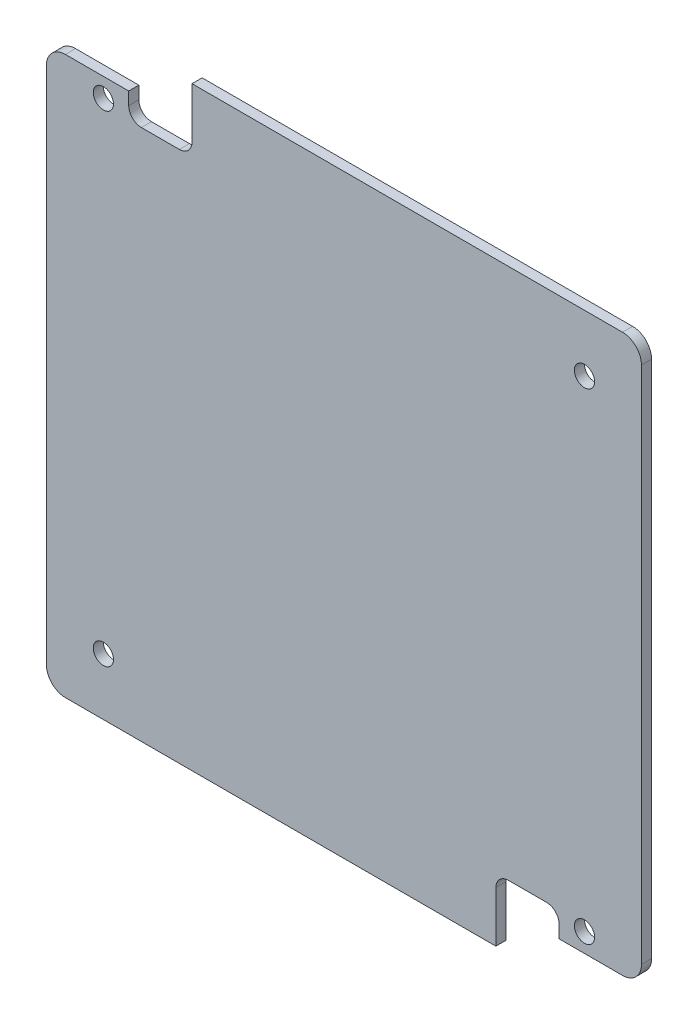
ISO-10303-21;
HEADER;
FILE_DESCRIPTION(('STEP AP214'),'2;1');
FILE_NAME('part.step','',(''),(''),'','','');
FILE_SCHEMA(('AUTOMOTIVE_DESIGN { 1 0 10303 214 1 1 1 1 }'));
ENDSEC;
DATA;
#1=APPLICATION_CONTEXT('core data for automotive mechanical design processes');
#2=APPLICATION_PROTOCOL_DEFINITION('international standard','automotive_design',2000,#1);
#3=PRODUCT_CONTEXT('',#1,'mechanical');
#4=PRODUCT('Part','Part','',(#3));
#5=PRODUCT_RELATED_PRODUCT_CATEGORY('part','',(#4));
#6=PRODUCT_DEFINITION_FORMATION('','',#4);
#7=PRODUCT_DEFINITION_CONTEXT('part definition',#1,'design');
#8=PRODUCT_DEFINITION('design','',#6,#7);
#9=PRODUCT_DEFINITION_SHAPE('','',#8);
#10=(LENGTH_UNIT() NAMED_UNIT(*) SI_UNIT(.MILLI.,.METRE.));
#11=(NAMED_UNIT(*) PLANE_ANGLE_UNIT() SI_UNIT($,.RADIAN.));
#12=(NAMED_UNIT(*) SI_UNIT($,.STERADIAN.) SOLID_ANGLE_UNIT());
#13=UNCERTAINTY_MEASURE_WITH_UNIT(LENGTH_MEASURE(1.E-05),#10,'distance_accuracy_value','');
#14=(GEOMETRIC_REPRESENTATION_CONTEXT(3) GLOBAL_UNCERTAINTY_ASSIGNED_CONTEXT((#13)) GLOBAL_UNIT_ASSIGNED_CONTEXT((#10,
#11,#12)) REPRESENTATION_CONTEXT('',''));
#15=CARTESIAN_POINT('',(0.,0.,0.));
#16=DIRECTION('',(0.,0.,1.));
#17=DIRECTION('',(1.,0.,0.));
#18=AXIS2_PLACEMENT_3D('',#15,#16,#17);
#19=CARTESIAN_POINT('',(3.43465612004684,6.9518569300749,0.));
#20=DIRECTION('',(0.,0.,1.));
#21=DIRECTION('',(1.,0.,0.));
#22=AXIS2_PLACEMENT_3D('',#19,#20,#21);
#23=PLANE('',#22);
#24=CARTESIAN_POINT('',(-78.5653438799532,82.9518569300749,0.));
#25=DIRECTION('',(0.,0.,-1.));
#26=DIRECTION('',(-1.,0.,0.));
#27=AXIS2_PLACEMENT_3D('',#24,#25,#26);
#28=CIRCLE('',#27,1.59999999999999);
#29=CARTESIAN_POINT('',(-80.1653438799532,82.9518569300749,0.));
#30=VERTEX_POINT('',#29);
#31=EDGE_CURVE('E387',#30,#30,#28,.T.);
#32=ORIENTED_EDGE('',*,*,#31,.F.);
#33=EDGE_LOOP('',(#32));
#34=FACE_BOUND('',#33,.T.);
#35=CARTESIAN_POINT('',(-2.56534387995316,6.95185693007487,0.));
#36=DIRECTION('',(0.,0.,-1.));
#37=DIRECTION('',(-1.,0.,0.));
#38=AXIS2_PLACEMENT_3D('',#35,#36,#37);
#39=CIRCLE('',#38,1.59999999999999);
#40=CARTESIAN_POINT('',(-4.16534387995315,6.95185693007487,0.));
#41=VERTEX_POINT('',#40);
#42=EDGE_CURVE('E375',#41,#41,#39,.T.);
#43=ORIENTED_EDGE('',*,*,#42,.F.);
#44=EDGE_LOOP('',(#43));
#45=FACE_BOUND('',#44,.T.);
#46=DIRECTION('',(1.,0.,0.));
#47=VECTOR('',#46,1.);
#48=CARTESIAN_POINT('',(-16.5653438799532,7.9518569300749,0.));
#49=LINE('',#48,#47);
#50=CARTESIAN_POINT('',(-14.5653438799532,7.9518569300749,0.));
#51=VERTEX_POINT('',#50);
#52=CARTESIAN_POINT('',(-8.56534387995316,7.9518569300749,0.));
#53=VERTEX_POINT('',#52);
#54=EDGE_CURVE('E229',#51,#53,#49,.T.);
#55=ORIENTED_EDGE('',*,*,#54,.F.);
#56=CARTESIAN_POINT('',(-14.5653438799532,5.9518569300749,0.));
#57=DIRECTION('',(0.,0.,1.));
#58=DIRECTION('',(1.,0.,0.));
#59=AXIS2_PLACEMENT_3D('',#56,#57,#58);
#60=CIRCLE('',#59,2.);
#61=CARTESIAN_POINT('',(-16.5653438799532,5.9518569300749,0.));
#62=VERTEX_POINT('',#61);
#63=EDGE_CURVE('E312',#51,#62,#60,.T.);
#64=ORIENTED_EDGE('',*,*,#63,.T.);
#65=DIRECTION('',(0.,-1.,0.));
#66=VECTOR('',#65,1.);
#67=CARTESIAN_POINT('',(-16.5653438799532,7.9518569300749,0.));
#68=LINE('',#67,#66);
#69=CARTESIAN_POINT('',(-16.5653438799532,-2.0481430699251,0.));
#70=VERTEX_POINT('',#69);
#71=EDGE_CURVE('E268',#62,#70,#68,.T.);
#72=ORIENTED_EDGE('',*,*,#71,.T.);
#73=DIRECTION('',(1.,0.,0.));
#74=VECTOR('',#73,1.);
#75=CARTESIAN_POINT('',(-84.5653438799531,-2.0481430699251,0.));
#76=LINE('',#75,#74);
#77=CARTESIAN_POINT('',(-84.5653438799531,-2.0481430699251,0.));
#78=VERTEX_POINT('',#77);
#79=EDGE_CURVE('E265',#78,#70,#76,.T.);
#80=ORIENTED_EDGE('',*,*,#79,.F.);
#81=CARTESIAN_POINT('',(-84.5653438799531,0.9518569300749,0.));
#82=DIRECTION('',(0.,0.,1.));
#83=DIRECTION('',(1.,0.,0.));
#84=AXIS2_PLACEMENT_3D('',#81,#82,#83);
#85=CIRCLE('',#84,3.);
#86=CARTESIAN_POINT('',(-87.5653438799531,0.951856930074922,0.));
#87=VERTEX_POINT('',#86);
#88=EDGE_CURVE('E263',#87,#78,#85,.T.);
#89=ORIENTED_EDGE('',*,*,#88,.F.);
#90=DIRECTION('',(0.,1.,0.));
#91=VECTOR('',#90,1.);
#92=CARTESIAN_POINT('',(-87.5653438799531,0.951856930074922,0.));
#93=LINE('',#92,#91);
#94=CARTESIAN_POINT('',(-87.5653438799531,82.9518569300748,0.));
#95=VERTEX_POINT('',#94);
#96=EDGE_CURVE('E260',#87,#95,#93,.T.);
#97=ORIENTED_EDGE('',*,*,#96,.T.);
#98=CARTESIAN_POINT('',(-84.5653438799531,82.9518569300749,0.));
#99=DIRECTION('',(0.,0.,1.));
#100=DIRECTION('',(1.,0.,0.));
#101=AXIS2_PLACEMENT_3D('',#98,#99,#100);
#102=CIRCLE('',#101,3.);
#103=CARTESIAN_POINT('',(-84.5653438799531,85.9518569300749,0.));
#104=VERTEX_POINT('',#103);
#105=EDGE_CURVE('E257',#104,#95,#102,.T.);
#106=ORIENTED_EDGE('',*,*,#105,.F.);
#107=DIRECTION('',(-1.,0.,0.));
#108=VECTOR('',#107,1.);
#109=CARTESIAN_POINT('',(-74.5653438799531,85.9518569300749,0.));
#110=LINE('',#109,#108);
#111=CARTESIAN_POINT('',(-74.5653438799531,85.9518569300749,0.));
#112=VERTEX_POINT('',#111);
#113=EDGE_CURVE('E255',#112,#104,#110,.T.);
#114=ORIENTED_EDGE('',*,*,#113,.F.);
#115=DIRECTION('',(0.,1.,0.));
#116=VECTOR('',#115,1.);
#117=CARTESIAN_POINT('',(-74.5653438799531,81.9518569300749,0.));
#118=LINE('',#117,#116);
#119=CARTESIAN_POINT('',(-74.5653438799531,83.9518569300749,0.));
#120=VERTEX_POINT('',#119);
#121=EDGE_CURVE('E253',#120,#112,#118,.T.);
#122=ORIENTED_EDGE('',*,*,#121,.F.);
#123=CARTESIAN_POINT('',(-72.5653438799531,83.9518569300749,0.));
#124=DIRECTION('',(0.,0.,1.));
#125=DIRECTION('',(1.,0.,0.));
#126=AXIS2_PLACEMENT_3D('',#123,#124,#125);
#127=CIRCLE('',#126,2.);
#128=CARTESIAN_POINT('',(-72.5653438799531,81.9518569300749,0.));
#129=VERTEX_POINT('',#128);
#130=EDGE_CURVE('E40',#120,#129,#127,.T.);
#131=ORIENTED_EDGE('',*,*,#130,.T.);
#132=DIRECTION('',(-1.,0.,0.));
#133=VECTOR('',#132,1.);
#134=CARTESIAN_POINT('',(-64.5653438799531,81.9518569300749,0.));
#135=LINE('',#134,#133);
#136=CARTESIAN_POINT('',(-66.5653438799531,81.9518569300749,0.));
#137=VERTEX_POINT('',#136);
#138=EDGE_CURVE('E250',#137,#129,#135,.T.);
#139=ORIENTED_EDGE('',*,*,#138,.F.);
#140=CARTESIAN_POINT('',(-66.5653438799531,83.9518569300749,0.));
#141=DIRECTION('',(0.,0.,1.));
#142=DIRECTION('',(1.,0.,0.));
#143=AXIS2_PLACEMENT_3D('',#140,#141,#142);
#144=CIRCLE('',#143,2.);
#145=CARTESIAN_POINT('',(-64.5653438799531,83.9518569300749,0.));
#146=VERTEX_POINT('',#145);
#147=EDGE_CURVE('E319',#137,#146,#144,.T.);
#148=ORIENTED_EDGE('',*,*,#147,.T.);
#149=DIRECTION('',(0.,-1.,0.));
#150=VECTOR('',#149,1.);
#151=CARTESIAN_POINT('',(-64.5653438799531,91.9518569300749,0.));
#152=LINE('',#151,#150);
#153=CARTESIAN_POINT('',(-64.5653438799531,91.9518569300749,0.));
#154=VERTEX_POINT('',#153);
#155=EDGE_CURVE('E247',#154,#146,#152,.T.);
#156=ORIENTED_EDGE('',*,*,#155,.F.);
#157=DIRECTION('',(1.,0.,0.));
#158=VECTOR('',#157,1.);
#159=CARTESIAN_POINT('',(-64.5653438799531,91.9518569300749,0.));
#160=LINE('',#159,#158);
#161=CARTESIAN_POINT('',(3.43465612004681,91.9518569300749,0.));
#162=VERTEX_POINT('',#161);
#163=EDGE_CURVE('E244',#154,#162,#160,.T.);
#164=ORIENTED_EDGE('',*,*,#163,.T.);
#165=CARTESIAN_POINT('',(3.43465612004683,88.9518569300749,0.));
#166=DIRECTION('',(0.,0.,-1.));
#167=DIRECTION('',(-1.,0.,0.));
#168=AXIS2_PLACEMENT_3D('',#165,#166,#167);
#169=CIRCLE('',#168,3.);
#170=CARTESIAN_POINT('',(6.43465612004683,88.9518569300748,0.));
#171=VERTEX_POINT('',#170);
#172=EDGE_CURVE('E241',#162,#171,#169,.T.);
#173=ORIENTED_EDGE('',*,*,#172,.T.);
#174=DIRECTION('',(0.,1.,0.));
#175=VECTOR('',#174,1.);
#176=CARTESIAN_POINT('',(6.43465612004684,6.9518569300749,0.));
#177=LINE('',#176,#175);
#178=CARTESIAN_POINT('',(6.43465612004684,6.9518569300749,0.));
#179=VERTEX_POINT('',#178);
#180=EDGE_CURVE('E238',#179,#171,#177,.T.);
#181=ORIENTED_EDGE('',*,*,#180,.F.);
#182=CARTESIAN_POINT('',(3.43465612004684,6.9518569300749,0.));
#183=DIRECTION('',(0.,0.,1.));
#184=DIRECTION('',(1.,0.,0.));
#185=AXIS2_PLACEMENT_3D('',#182,#183,#184);
#186=CIRCLE('',#185,3.);
#187=CARTESIAN_POINT('',(3.43465612004684,3.9518569300749,0.));
#188=VERTEX_POINT('',#187);
#189=EDGE_CURVE('E236',#188,#179,#186,.T.);
#190=ORIENTED_EDGE('',*,*,#189,.F.);
#191=DIRECTION('',(-1.,0.,0.));
#192=VECTOR('',#191,1.);
#193=CARTESIAN_POINT('',(3.43465612004684,3.9518569300749,0.));
#194=LINE('',#193,#192);
#195=CARTESIAN_POINT('',(-6.56534387995316,3.9518569300749,0.));
#196=VERTEX_POINT('',#195);
#197=EDGE_CURVE('E234',#188,#196,#194,.T.);
#198=ORIENTED_EDGE('',*,*,#197,.T.);
#199=DIRECTION('',(0.,-1.,0.));
#200=VECTOR('',#199,1.);
#201=CARTESIAN_POINT('',(-6.56534387995316,7.9518569300749,0.));
#202=LINE('',#201,#200);
#203=CARTESIAN_POINT('',(-6.56534387995316,5.9518569300749,0.));
#204=VERTEX_POINT('',#203);
#205=EDGE_CURVE('E185',#204,#196,#202,.T.);
#206=ORIENTED_EDGE('',*,*,#205,.F.);
#207=CARTESIAN_POINT('',(-8.56534387995316,5.9518569300749,0.));
#208=DIRECTION('',(0.,0.,1.));
#209=DIRECTION('',(1.,0.,0.));
#210=AXIS2_PLACEMENT_3D('',#207,#208,#209);
#211=CIRCLE('',#210,2.);
#212=EDGE_CURVE('E316',#204,#53,#211,.T.);
#213=ORIENTED_EDGE('',*,*,#212,.T.);
#214=EDGE_LOOP('',(#55,#64,#72,#80,#89,#97,#106,#114,#122,#131,#139,#148,#156,#164,#173,#181,
#190,#198,#206,#213));
#215=FACE_BOUND('',#214,.T.);
#216=CARTESIAN_POINT('',(-2.56534387995319,82.9518569300749,0.));
#217=DIRECTION('',(0.,0.,-1.));
#218=DIRECTION('',(-1.,0.,0.));
#219=AXIS2_PLACEMENT_3D('',#216,#217,#218);
#220=CIRCLE('',#219,1.59999999999999);
#221=CARTESIAN_POINT('',(-4.16534387995318,82.9518569300749,0.));
#222=VERTEX_POINT('',#221);
#223=EDGE_CURVE('E381',#222,#222,#220,.T.);
#224=ORIENTED_EDGE('',*,*,#223,.F.);
#225=EDGE_LOOP('',(#224));
#226=FACE_BOUND('',#225,.T.);
#227=CARTESIAN_POINT('',(-78.5653438799531,6.95185693007482,0.));
#228=DIRECTION('',(0.,0.,-1.));
#229=DIRECTION('',(-1.,0.,0.));
#230=AXIS2_PLACEMENT_3D('',#227,#228,#229);
#231=CIRCLE('',#230,1.59999999999999);
#232=CARTESIAN_POINT('',(-80.1653438799531,6.95185693007482,0.));
#233=VERTEX_POINT('',#232);
#234=EDGE_CURVE('E393',#233,#233,#231,.T.);
#235=ORIENTED_EDGE('',*,*,#234,.F.);
#236=EDGE_LOOP('',(#235));
#237=FACE_BOUND('',#236,.T.);
#238=ADVANCED_FACE('F32',(#34,#45,#215,#226,#237),#23,.F.);
#239=CARTESIAN_POINT('',(-16.5653438799532,7.9518569300749,1.6));
#240=DIRECTION('',(0.,1.,0.));
#241=DIRECTION('',(0.,0.,1.));
#242=AXIS2_PLACEMENT_3D('',#239,#240,#241);
#243=PLANE('',#242);
#244=DIRECTION('',(1.,0.,0.));
#245=VECTOR('',#244,1.);
#246=CARTESIAN_POINT('',(-16.5653438799532,7.9518569300749,1.6));
#247=LINE('',#246,#245);
#248=CARTESIAN_POINT('',(-14.5653438799532,7.9518569300749,1.6));
#249=VERTEX_POINT('',#248);
#250=CARTESIAN_POINT('',(-8.56534387995316,7.9518569300749,1.6));
#251=VERTEX_POINT('',#250);
#252=EDGE_CURVE('E179',#249,#251,#247,.T.);
#253=ORIENTED_EDGE('',*,*,#252,.F.);
#254=DIRECTION('',(0.,0.,-1.));
#255=VECTOR('',#254,1.);
#256=CARTESIAN_POINT('',(-14.5653438799532,7.9518569300749,1.6));
#257=LINE('',#256,#255);
#258=EDGE_CURVE('E296',#249,#51,#257,.T.);
#259=ORIENTED_EDGE('',*,*,#258,.T.);
#260=ORIENTED_EDGE('',*,*,#54,.T.);
#261=DIRECTION('',(0.,0.,-1.));
#262=VECTOR('',#261,1.);
#263=CARTESIAN_POINT('',(-8.56534387995316,7.9518569300749,1.6));
#264=LINE('',#263,#262);
#265=EDGE_CURVE('E189',#53,#251,#264,.F.);
#266=ORIENTED_EDGE('',*,*,#265,.T.);
#267=EDGE_LOOP('',(#253,#259,#260,#266));
#268=FACE_BOUND('',#267,.T.);
#269=ADVANCED_FACE('F368',(#268),#243,.F.);
#270=CARTESIAN_POINT('',(-6.56534387995316,7.9518569300749,1.6));
#271=DIRECTION('',(1.,0.,0.));
#272=DIRECTION('',(0.,1.,0.));
#273=AXIS2_PLACEMENT_3D('',#270,#271,#272);
#274=PLANE('',#273);
#275=DIRECTION('',(0.,-1.,0.));
#276=VECTOR('',#275,1.);
#277=CARTESIAN_POINT('',(-6.56534387995316,7.9518569300749,1.6));
#278=LINE('',#277,#276);
#279=CARTESIAN_POINT('',(-6.56534387995316,5.9518569300749,1.6));
#280=VERTEX_POINT('',#279);
#281=CARTESIAN_POINT('',(-6.56534387995316,3.9518569300749,1.6));
#282=VERTEX_POINT('',#281);
#283=EDGE_CURVE('E166',#280,#282,#278,.T.);
#284=ORIENTED_EDGE('',*,*,#283,.F.);
#285=DIRECTION('',(0.,0.,-1.));
#286=VECTOR('',#285,1.);
#287=CARTESIAN_POINT('',(-6.56534387995316,5.9518569300749,0.));
#288=LINE('',#287,#286);
#289=EDGE_CURVE('E301',#280,#204,#288,.T.);
#290=ORIENTED_EDGE('',*,*,#289,.T.);
#291=ORIENTED_EDGE('',*,*,#205,.T.);
#292=DIRECTION('',(0.,0.,-1.));
#293=VECTOR('',#292,1.);
#294=CARTESIAN_POINT('',(-6.56534387995316,3.9518569300749,1.6));
#295=LINE('',#294,#293);
#296=EDGE_CURVE('E182',#282,#196,#295,.T.);
#297=ORIENTED_EDGE('',*,*,#296,.F.);
#298=EDGE_LOOP('',(#284,#290,#291,#297));
#299=FACE_BOUND('',#298,.T.);
#300=ADVANCED_FACE('F183',(#299),#274,.F.);
#301=CARTESIAN_POINT('',(3.43465612004684,3.9518569300749,1.6));
#302=DIRECTION('',(0.,-1.,0.));
#303=DIRECTION('',(1.,0.,0.));
#304=AXIS2_PLACEMENT_3D('',#301,#302,#303);
#305=PLANE('',#304);
#306=ORIENTED_EDGE('',*,*,#197,.F.);
#307=DIRECTION('',(0.,0.,-1.));
#308=VECTOR('',#307,1.);
#309=CARTESIAN_POINT('',(3.43465612004684,3.9518569300749,1.6));
#310=LINE('',#309,#308);
#311=CARTESIAN_POINT('',(3.43465612004684,3.9518569300749,1.6));
#312=VERTEX_POINT('',#311);
#313=EDGE_CURVE('E190',#312,#188,#310,.T.);
#314=ORIENTED_EDGE('',*,*,#313,.F.);
#315=DIRECTION('',(-1.,0.,0.));
#316=VECTOR('',#315,1.);
#317=CARTESIAN_POINT('',(3.4257089308049,3.9518569300749,1.6));
#318=LINE('',#317,#316);
#319=EDGE_CURVE('E171',#312,#282,#318,.T.);
#320=ORIENTED_EDGE('',*,*,#319,.T.);
#321=ORIENTED_EDGE('',*,*,#296,.T.);
#322=EDGE_LOOP('',(#306,#314,#320,#321));
#323=FACE_BOUND('',#322,.T.);
#324=ADVANCED_FACE('F192',(#323),#305,.T.);
#325=CARTESIAN_POINT('',(3.43465612004684,6.9518569300749,1.6));
#326=DIRECTION('',(0.,0.,-1.));
#327=DIRECTION('',(-1.,0.,0.));
#328=AXIS2_PLACEMENT_3D('',#325,#326,#327);
#329=CYLINDRICAL_SURFACE('',#328,3.);
#330=ORIENTED_EDGE('',*,*,#189,.T.);
#331=DIRECTION('',(0.,0.,-1.));
#332=VECTOR('',#331,1.);
#333=CARTESIAN_POINT('',(6.43465612004684,6.9518569300749,1.6));
#334=LINE('',#333,#332);
#335=CARTESIAN_POINT('',(6.43465612004684,6.9518569300749,1.6));
#336=VERTEX_POINT('',#335);
#337=EDGE_CURVE('E291',#336,#179,#334,.T.);
#338=ORIENTED_EDGE('',*,*,#337,.F.);
#339=CARTESIAN_POINT('',(3.43465612004684,6.9518569300749,1.6));
#340=DIRECTION('',(0.,0.,1.));
#341=DIRECTION('',(1.,0.,0.));
#342=AXIS2_PLACEMENT_3D('',#339,#340,#341);
#343=CIRCLE('',#342,3.);
#344=EDGE_CURVE('E194',#312,#336,#343,.T.);
#345=ORIENTED_EDGE('',*,*,#344,.F.);
#346=ORIENTED_EDGE('',*,*,#313,.T.);
#347=EDGE_LOOP('',(#330,#338,#345,#346));
#348=FACE_BOUND('',#347,.T.);
#349=ADVANCED_FACE('F443',(#348),#329,.T.);
#350=CARTESIAN_POINT('',(6.43465612004684,6.9518569300749,1.6));
#351=DIRECTION('',(-1.,0.,0.));
#352=DIRECTION('',(0.,-1.,0.));
#353=AXIS2_PLACEMENT_3D('',#350,#351,#352);
#354=PLANE('',#353);
#355=ORIENTED_EDGE('',*,*,#180,.T.);
#356=DIRECTION('',(0.,0.,-1.));
#357=VECTOR('',#356,1.);
#358=CARTESIAN_POINT('',(6.43465612004683,88.9518569300748,1.6));
#359=LINE('',#358,#357);
#360=CARTESIAN_POINT('',(6.43465612004683,88.9518569300748,1.6));
#361=VERTEX_POINT('',#360);
#362=EDGE_CURVE('E289',#361,#171,#359,.T.);
#363=ORIENTED_EDGE('',*,*,#362,.F.);
#364=DIRECTION('',(0.,1.,0.));
#365=VECTOR('',#364,1.);
#366=CARTESIAN_POINT('',(6.43465612004684,6.9518569300749,1.6));
#367=LINE('',#366,#365);
#368=EDGE_CURVE('E196',#336,#361,#367,.T.);
#369=ORIENTED_EDGE('',*,*,#368,.F.);
#370=ORIENTED_EDGE('',*,*,#337,.T.);
#371=EDGE_LOOP('',(#355,#363,#369,#370));
#372=FACE_BOUND('',#371,.T.);
#373=ADVANCED_FACE('F439',(#372),#354,.F.);
#374=CARTESIAN_POINT('',(3.43465612004683,88.9518569300749,1.6));
#375=DIRECTION('',(0.,0.,-1.));
#376=DIRECTION('',(-1.,0.,0.));
#377=AXIS2_PLACEMENT_3D('',#374,#375,#376);
#378=CYLINDRICAL_SURFACE('',#377,3.);
#379=ORIENTED_EDGE('',*,*,#172,.F.);
#380=DIRECTION('',(0.,0.,-1.));
#381=VECTOR('',#380,1.);
#382=CARTESIAN_POINT('',(3.43465612004681,91.9518569300749,1.6));
#383=LINE('',#382,#381);
#384=CARTESIAN_POINT('',(3.43465612004681,91.9518569300749,1.6));
#385=VERTEX_POINT('',#384);
#386=EDGE_CURVE('E287',#385,#162,#383,.T.);
#387=ORIENTED_EDGE('',*,*,#386,.F.);
#388=CARTESIAN_POINT('',(3.43465612004683,88.9518569300749,1.6));
#389=DIRECTION('',(0.,0.,-1.));
#390=DIRECTION('',(-1.,0.,0.));
#391=AXIS2_PLACEMENT_3D('',#388,#389,#390);
#392=CIRCLE('',#391,3.);
#393=EDGE_CURVE('E201',#385,#361,#392,.T.);
#394=ORIENTED_EDGE('',*,*,#393,.T.);
#395=ORIENTED_EDGE('',*,*,#362,.T.);
#396=EDGE_LOOP('',(#379,#387,#394,#395));
#397=FACE_BOUND('',#396,.T.);
#398=ADVANCED_FACE('F435',(#397),#378,.T.);
#399=CARTESIAN_POINT('',(-64.5653438799531,91.9518569300749,1.6));
#400=DIRECTION('',(0.,1.,0.));
#401=DIRECTION('',(0.,0.,1.));
#402=AXIS2_PLACEMENT_3D('',#399,#400,#401);
#403=PLANE('',#402);
#404=ORIENTED_EDGE('',*,*,#163,.F.);
#405=DIRECTION('',(0.,0.,-1.));
#406=VECTOR('',#405,1.);
#407=CARTESIAN_POINT('',(-64.5653438799531,91.9518569300749,1.6));
#408=LINE('',#407,#406);
#409=CARTESIAN_POINT('',(-64.5653438799531,91.9518569300749,1.6));
#410=VERTEX_POINT('',#409);
#411=EDGE_CURVE('E285',#410,#154,#408,.T.);
#412=ORIENTED_EDGE('',*,*,#411,.F.);
#413=DIRECTION('',(1.,0.,0.));
#414=VECTOR('',#413,1.);
#415=CARTESIAN_POINT('',(-64.5653438799531,91.9518569300749,1.6));
#416=LINE('',#415,#414);
#417=EDGE_CURVE('E204',#410,#385,#416,.T.);
#418=ORIENTED_EDGE('',*,*,#417,.T.);
#419=ORIENTED_EDGE('',*,*,#386,.T.);
#420=EDGE_LOOP('',(#404,#412,#418,#419));
#421=FACE_BOUND('',#420,.T.);
#422=ADVANCED_FACE('F431',(#421),#403,.T.);
#423=CARTESIAN_POINT('',(-64.5653438799531,91.9518569300749,1.6));
#424=DIRECTION('',(1.,0.,0.));
#425=DIRECTION('',(0.,0.,-1.));
#426=AXIS2_PLACEMENT_3D('',#423,#424,#425);
#427=PLANE('',#426);
#428=ORIENTED_EDGE('',*,*,#155,.T.);
#429=DIRECTION('',(0.,0.,-1.));
#430=VECTOR('',#429,1.);
#431=CARTESIAN_POINT('',(-64.5653438799531,83.9518569300749,1.6));
#432=LINE('',#431,#430);
#433=CARTESIAN_POINT('',(-64.5653438799531,83.9518569300749,1.6));
#434=VERTEX_POINT('',#433);
#435=EDGE_CURVE('E308',#146,#434,#432,.F.);
#436=ORIENTED_EDGE('',*,*,#435,.T.);
#437=DIRECTION('',(0.,-1.,0.));
#438=VECTOR('',#437,1.);
#439=CARTESIAN_POINT('',(-64.5653438799531,91.9518569300749,1.6));
#440=LINE('',#439,#438);
#441=EDGE_CURVE('E207',#410,#434,#440,.T.);
#442=ORIENTED_EDGE('',*,*,#441,.F.);
#443=ORIENTED_EDGE('',*,*,#411,.T.);
#444=EDGE_LOOP('',(#428,#436,#442,#443));
#445=FACE_BOUND('',#444,.T.);
#446=ADVANCED_FACE('F428',(#445),#427,.F.);
#447=CARTESIAN_POINT('',(-64.5653438799531,81.9518569300749,1.6));
#448=DIRECTION('',(0.,-1.,0.));
#449=DIRECTION('',(0.,0.,-1.));
#450=AXIS2_PLACEMENT_3D('',#447,#448,#449);
#451=PLANE('',#450);
#452=DIRECTION('',(-1.,0.,0.));
#453=VECTOR('',#452,1.);
#454=CARTESIAN_POINT('',(-64.5653438799531,81.9518569300749,1.6));
#455=LINE('',#454,#453);
#456=CARTESIAN_POINT('',(-66.5653438799531,81.9518569300749,1.6));
#457=VERTEX_POINT('',#456);
#458=CARTESIAN_POINT('',(-72.5653438799531,81.9518569300749,1.6));
#459=VERTEX_POINT('',#458);
#460=EDGE_CURVE('E210',#457,#459,#455,.T.);
#461=ORIENTED_EDGE('',*,*,#460,.F.);
#462=DIRECTION('',(0.,0.,-1.));
#463=VECTOR('',#462,1.);
#464=CARTESIAN_POINT('',(-66.5653438799531,81.9518569300749,0.));
#465=LINE('',#464,#463);
#466=EDGE_CURVE('E305',#457,#137,#465,.T.);
#467=ORIENTED_EDGE('',*,*,#466,.T.);
#468=ORIENTED_EDGE('',*,*,#138,.T.);
#469=DIRECTION('',(0.,0.,-1.));
#470=VECTOR('',#469,1.);
#471=CARTESIAN_POINT('',(-72.5653438799531,81.9518569300749,1.6));
#472=LINE('',#471,#470);
#473=EDGE_CURVE('E303',#129,#459,#472,.F.);
#474=ORIENTED_EDGE('',*,*,#473,.T.);
#475=EDGE_LOOP('',(#461,#467,#468,#474));
#476=FACE_BOUND('',#475,.T.);
#477=ADVANCED_FACE('F330',(#476),#451,.F.);
#478=CARTESIAN_POINT('',(-74.5653438799531,81.9518569300749,1.6));
#479=DIRECTION('',(-1.,0.,0.));
#480=DIRECTION('',(0.,0.,1.));
#481=AXIS2_PLACEMENT_3D('',#478,#479,#480);
#482=PLANE('',#481);
#483=DIRECTION('',(0.,1.,0.));
#484=VECTOR('',#483,1.);
#485=CARTESIAN_POINT('',(-74.5653438799531,81.9518569300749,1.6));
#486=LINE('',#485,#484);
#487=CARTESIAN_POINT('',(-74.5653438799531,83.9518569300749,1.6));
#488=VERTEX_POINT('',#487);
#489=CARTESIAN_POINT('',(-74.5653438799531,85.9518569300749,1.6));
#490=VERTEX_POINT('',#489);
#491=EDGE_CURVE('E212',#488,#490,#486,.T.);
#492=ORIENTED_EDGE('',*,*,#491,.F.);
#493=DIRECTION('',(0.,0.,-1.));
#494=VECTOR('',#493,1.);
#495=CARTESIAN_POINT('',(-74.5653438799531,83.9518569300749,0.));
#496=LINE('',#495,#494);
#497=EDGE_CURVE('E310',#488,#120,#496,.T.);
#498=ORIENTED_EDGE('',*,*,#497,.T.);
#499=ORIENTED_EDGE('',*,*,#121,.T.);
#500=DIRECTION('',(0.,0.,-1.));
#501=VECTOR('',#500,1.);
#502=CARTESIAN_POINT('',(-74.5653438799531,85.9518569300749,1.6));
#503=LINE('',#502,#501);
#504=EDGE_CURVE('E282',#490,#112,#503,.T.);
#505=ORIENTED_EDGE('',*,*,#504,.F.);
#506=EDGE_LOOP('',(#492,#498,#499,#505));
#507=FACE_BOUND('',#506,.T.);
#508=ADVANCED_FACE('F333',(#507),#482,.F.);
#509=CARTESIAN_POINT('',(-74.5653438799531,85.9518569300749,1.6));
#510=DIRECTION('',(0.,-1.,0.));
#511=DIRECTION('',(0.,0.,-1.));
#512=AXIS2_PLACEMENT_3D('',#509,#510,#511);
#513=PLANE('',#512);
#514=ORIENTED_EDGE('',*,*,#113,.T.);
#515=DIRECTION('',(0.,0.,-1.));
#516=VECTOR('',#515,1.);
#517=CARTESIAN_POINT('',(-84.5653438799531,85.9518569300749,1.6));
#518=LINE('',#517,#516);
#519=CARTESIAN_POINT('',(-84.5653438799531,85.9518569300749,1.6));
#520=VERTEX_POINT('',#519);
#521=EDGE_CURVE('E279',#520,#104,#518,.T.);
#522=ORIENTED_EDGE('',*,*,#521,.F.);
#523=DIRECTION('',(-1.,0.,0.));
#524=VECTOR('',#523,1.);
#525=CARTESIAN_POINT('',(-74.5653438799531,85.9518569300749,1.6));
#526=LINE('',#525,#524);
#527=EDGE_CURVE('E214',#490,#520,#526,.T.);
#528=ORIENTED_EDGE('',*,*,#527,.F.);
#529=ORIENTED_EDGE('',*,*,#504,.T.);
#530=EDGE_LOOP('',(#514,#522,#528,#529));
#531=FACE_BOUND('',#530,.T.);
#532=ADVANCED_FACE('F341',(#531),#513,.F.);
#533=CARTESIAN_POINT('',(-84.5653438799531,82.9518569300749,1.6));
#534=DIRECTION('',(0.,0.,-1.));
#535=DIRECTION('',(-1.,0.,0.));
#536=AXIS2_PLACEMENT_3D('',#533,#534,#535);
#537=CYLINDRICAL_SURFACE('',#536,3.);
#538=ORIENTED_EDGE('',*,*,#105,.T.);
#539=DIRECTION('',(0.,0.,-1.));
#540=VECTOR('',#539,1.);
#541=CARTESIAN_POINT('',(-87.5653438799531,82.9518569300748,1.6));
#542=LINE('',#541,#540);
#543=CARTESIAN_POINT('',(-87.5653438799531,82.9518569300748,1.6));
#544=VERTEX_POINT('',#543);
#545=EDGE_CURVE('E277',#544,#95,#542,.T.);
#546=ORIENTED_EDGE('',*,*,#545,.F.);
#547=CARTESIAN_POINT('',(-84.5653438799531,82.9518569300749,1.6));
#548=DIRECTION('',(0.,0.,1.));
#549=DIRECTION('',(1.,0.,0.));
#550=AXIS2_PLACEMENT_3D('',#547,#548,#549);
#551=CIRCLE('',#550,3.);
#552=EDGE_CURVE('E216',#520,#544,#551,.T.);
#553=ORIENTED_EDGE('',*,*,#552,.F.);
#554=ORIENTED_EDGE('',*,*,#521,.T.);
#555=EDGE_LOOP('',(#538,#546,#553,#554));
#556=FACE_BOUND('',#555,.T.);
#557=ADVANCED_FACE('F344',(#556),#537,.T.);
#558=CARTESIAN_POINT('',(-87.5653438799531,0.951856930074922,1.6));
#559=DIRECTION('',(-1.,0.,0.));
#560=DIRECTION('',(0.,0.,1.));
#561=AXIS2_PLACEMENT_3D('',#558,#559,#560);
#562=PLANE('',#561);
#563=ORIENTED_EDGE('',*,*,#96,.F.);
#564=DIRECTION('',(0.,0.,-1.));
#565=VECTOR('',#564,1.);
#566=CARTESIAN_POINT('',(-87.5653438799531,0.951856930074922,1.6));
#567=LINE('',#566,#565);
#568=CARTESIAN_POINT('',(-87.5653438799531,0.951856930074922,1.6));
#569=VERTEX_POINT('',#568);
#570=EDGE_CURVE('E275',#569,#87,#567,.T.);
#571=ORIENTED_EDGE('',*,*,#570,.F.);
#572=DIRECTION('',(0.,1.,0.));
#573=VECTOR('',#572,1.);
#574=CARTESIAN_POINT('',(-87.5653438799531,0.951856930074922,1.6));
#575=LINE('',#574,#573);
#576=EDGE_CURVE('E218',#569,#544,#575,.T.);
#577=ORIENTED_EDGE('',*,*,#576,.T.);
#578=ORIENTED_EDGE('',*,*,#545,.T.);
#579=EDGE_LOOP('',(#563,#571,#577,#578));
#580=FACE_BOUND('',#579,.T.);
#581=ADVANCED_FACE('F347',(#580),#562,.T.);
#582=CARTESIAN_POINT('',(-84.5653438799531,0.9518569300749,1.6));
#583=DIRECTION('',(0.,0.,-1.));
#584=DIRECTION('',(-1.,0.,0.));
#585=AXIS2_PLACEMENT_3D('',#582,#583,#584);
#586=CYLINDRICAL_SURFACE('',#585,3.);
#587=ORIENTED_EDGE('',*,*,#88,.T.);
#588=DIRECTION('',(0.,0.,-1.));
#589=VECTOR('',#588,1.);
#590=CARTESIAN_POINT('',(-84.5653438799531,-2.0481430699251,1.6));
#591=LINE('',#590,#589);
#592=CARTESIAN_POINT('',(-84.5653438799531,-2.0481430699251,1.6));
#593=VERTEX_POINT('',#592);
#594=EDGE_CURVE('E272',#593,#78,#591,.T.);
#595=ORIENTED_EDGE('',*,*,#594,.F.);
#596=CARTESIAN_POINT('',(-84.5653438799531,0.9518569300749,1.6));
#597=DIRECTION('',(0.,0.,1.));
#598=DIRECTION('',(1.,0.,0.));
#599=AXIS2_PLACEMENT_3D('',#596,#597,#598);
#600=CIRCLE('',#599,3.);
#601=EDGE_CURVE('E221',#569,#593,#600,.T.);
#602=ORIENTED_EDGE('',*,*,#601,.F.);
#603=ORIENTED_EDGE('',*,*,#570,.T.);
#604=EDGE_LOOP('',(#587,#595,#602,#603));
#605=FACE_BOUND('',#604,.T.);
#606=ADVANCED_FACE('F353',(#605),#586,.T.);
#607=CARTESIAN_POINT('',(-84.5653438799531,-2.0481430699251,1.6));
#608=DIRECTION('',(0.,1.,0.));
#609=DIRECTION('',(-1.,0.,0.));
#610=AXIS2_PLACEMENT_3D('',#607,#608,#609);
#611=PLANE('',#610);
#612=ORIENTED_EDGE('',*,*,#79,.T.);
#613=DIRECTION('',(0.,0.,-1.));
#614=VECTOR('',#613,1.);
#615=CARTESIAN_POINT('',(-16.5653438799532,-2.0481430699251,1.6));
#616=LINE('',#615,#614);
#617=CARTESIAN_POINT('',(-16.5653438799532,-2.0481430699251,1.6));
#618=VERTEX_POINT('',#617);
#619=EDGE_CURVE('E228',#618,#70,#616,.T.);
#620=ORIENTED_EDGE('',*,*,#619,.F.);
#621=DIRECTION('',(1.,0.,0.));
#622=VECTOR('',#621,1.);
#623=CARTESIAN_POINT('',(-84.5653438799531,-2.0481430699251,1.6));
#624=LINE('',#623,#622);
#625=EDGE_CURVE('E223',#593,#618,#624,.T.);
#626=ORIENTED_EDGE('',*,*,#625,.F.);
#627=ORIENTED_EDGE('',*,*,#594,.T.);
#628=EDGE_LOOP('',(#612,#620,#626,#627));
#629=FACE_BOUND('',#628,.T.);
#630=ADVANCED_FACE('F357',(#629),#611,.F.);
#631=CARTESIAN_POINT('',(-16.5653438799532,7.9518569300749,1.6));
#632=DIRECTION('',(1.,0.,0.));
#633=DIRECTION('',(0.,1.,0.));
#634=AXIS2_PLACEMENT_3D('',#631,#632,#633);
#635=PLANE('',#634);
#636=ORIENTED_EDGE('',*,*,#71,.F.);
#637=DIRECTION('',(0.,0.,-1.));
#638=VECTOR('',#637,1.);
#639=CARTESIAN_POINT('',(-16.5653438799532,5.9518569300749,1.6));
#640=LINE('',#639,#638);
#641=CARTESIAN_POINT('',(-16.5653438799532,5.9518569300749,1.6));
#642=VERTEX_POINT('',#641);
#643=EDGE_CURVE('E299',#62,#642,#640,.F.);
#644=ORIENTED_EDGE('',*,*,#643,.T.);
#645=DIRECTION('',(0.,-1.,0.));
#646=VECTOR('',#645,1.);
#647=CARTESIAN_POINT('',(-16.5653438799532,7.9518569300749,1.6));
#648=LINE('',#647,#646);
#649=EDGE_CURVE('E226',#642,#618,#648,.T.);
#650=ORIENTED_EDGE('',*,*,#649,.T.);
#651=ORIENTED_EDGE('',*,*,#619,.T.);
#652=EDGE_LOOP('',(#636,#644,#650,#651));
#653=FACE_BOUND('',#652,.T.);
#654=ADVANCED_FACE('F360',(#653),#635,.T.);
#655=CARTESIAN_POINT('',(3.43465612004684,6.9518569300749,1.6));
#656=DIRECTION('',(0.,0.,1.));
#657=DIRECTION('',(1.,0.,0.));
#658=AXIS2_PLACEMENT_3D('',#655,#656,#657);
#659=PLANE('',#658);
#660=CARTESIAN_POINT('',(-78.5653438799531,6.95185693007482,1.6));
#661=DIRECTION('',(0.,0.,1.));
#662=DIRECTION('',(1.,0.,0.));
#663=AXIS2_PLACEMENT_3D('',#660,#661,#662);
#664=CIRCLE('',#663,1.6);
#665=CARTESIAN_POINT('',(-76.9653438799532,6.95185693007482,1.6));
#666=VERTEX_POINT('',#665);
#667=EDGE_CURVE('E390',#666,#666,#664,.T.);
#668=ORIENTED_EDGE('',*,*,#667,.F.);
#669=EDGE_LOOP('',(#668));
#670=FACE_BOUND('',#669,.T.);
#671=CARTESIAN_POINT('',(-78.5653438799532,82.9518569300749,1.6));
#672=DIRECTION('',(0.,0.,1.));
#673=DIRECTION('',(1.,0.,0.));
#674=AXIS2_PLACEMENT_3D('',#671,#672,#673);
#675=CIRCLE('',#674,1.6);
#676=CARTESIAN_POINT('',(-76.9653438799532,82.9518569300749,1.6));
#677=VERTEX_POINT('',#676);
#678=EDGE_CURVE('E384',#677,#677,#675,.T.);
#679=ORIENTED_EDGE('',*,*,#678,.F.);
#680=EDGE_LOOP('',(#679));
#681=FACE_BOUND('',#680,.T.);
#682=CARTESIAN_POINT('',(-2.56534387995319,82.9518569300749,1.6));
#683=DIRECTION('',(0.,0.,1.));
#684=DIRECTION('',(1.,0.,0.));
#685=AXIS2_PLACEMENT_3D('',#682,#683,#684);
#686=CIRCLE('',#685,1.59999999999999);
#687=CARTESIAN_POINT('',(-0.965343879953198,82.9518569300749,1.6));
#688=VERTEX_POINT('',#687);
#689=EDGE_CURVE('E378',#688,#688,#686,.T.);
#690=ORIENTED_EDGE('',*,*,#689,.F.);
#691=EDGE_LOOP('',(#690));
#692=FACE_BOUND('',#691,.T.);
#693=CARTESIAN_POINT('',(-2.56534387995316,6.95185693007487,1.6));
#694=DIRECTION('',(0.,0.,1.));
#695=DIRECTION('',(1.,0.,0.));
#696=AXIS2_PLACEMENT_3D('',#693,#694,#695);
#697=CIRCLE('',#696,1.59999999999999);
#698=CARTESIAN_POINT('',(-0.96534387995317,6.95185693007487,1.6));
#699=VERTEX_POINT('',#698);
#700=EDGE_CURVE('E232',#699,#699,#697,.T.);
#701=ORIENTED_EDGE('',*,*,#700,.F.);
#702=EDGE_LOOP('',(#701));
#703=FACE_BOUND('',#702,.T.);
#704=ORIENTED_EDGE('',*,*,#649,.F.);
#705=CARTESIAN_POINT('',(-14.5653438799532,5.9518569300749,1.6));
#706=DIRECTION('',(0.,0.,1.));
#707=DIRECTION('',(1.,0.,0.));
#708=AXIS2_PLACEMENT_3D('',#705,#706,#707);
#709=CIRCLE('',#708,2.);
#710=EDGE_CURVE('E314',#642,#249,#709,.F.);
#711=ORIENTED_EDGE('',*,*,#710,.T.);
#712=ORIENTED_EDGE('',*,*,#252,.T.);
#713=CARTESIAN_POINT('',(-8.56534387995316,5.9518569300749,1.6));
#714=DIRECTION('',(0.,0.,1.));
#715=DIRECTION('',(1.,0.,0.));
#716=AXIS2_PLACEMENT_3D('',#713,#714,#715);
#717=CIRCLE('',#716,2.);
#718=EDGE_CURVE('E175',#251,#280,#717,.F.);
#719=ORIENTED_EDGE('',*,*,#718,.T.);
#720=ORIENTED_EDGE('',*,*,#283,.T.);
#721=ORIENTED_EDGE('',*,*,#319,.F.);
#722=ORIENTED_EDGE('',*,*,#344,.T.);
#723=ORIENTED_EDGE('',*,*,#368,.T.);
#724=ORIENTED_EDGE('',*,*,#393,.F.);
#725=ORIENTED_EDGE('',*,*,#417,.F.);
#726=ORIENTED_EDGE('',*,*,#441,.T.);
#727=CARTESIAN_POINT('',(-66.5653438799531,83.9518569300749,1.6));
#728=DIRECTION('',(0.,0.,1.));
#729=DIRECTION('',(1.,0.,0.));
#730=AXIS2_PLACEMENT_3D('',#727,#728,#729);
#731=CIRCLE('',#730,2.);
#732=EDGE_CURVE('E321',#434,#457,#731,.F.);
#733=ORIENTED_EDGE('',*,*,#732,.T.);
#734=ORIENTED_EDGE('',*,*,#460,.T.);
#735=CARTESIAN_POINT('',(-72.5653438799531,83.9518569300749,1.6));
#736=DIRECTION('',(0.,0.,1.));
#737=DIRECTION('',(1.,0.,0.));
#738=AXIS2_PLACEMENT_3D('',#735,#736,#737);
#739=CIRCLE('',#738,2.);
#740=EDGE_CURVE('E11',#459,#488,#739,.F.);
#741=ORIENTED_EDGE('',*,*,#740,.T.);
#742=ORIENTED_EDGE('',*,*,#491,.T.);
#743=ORIENTED_EDGE('',*,*,#527,.T.);
#744=ORIENTED_EDGE('',*,*,#552,.T.);
#745=ORIENTED_EDGE('',*,*,#576,.F.);
#746=ORIENTED_EDGE('',*,*,#601,.T.);
#747=ORIENTED_EDGE('',*,*,#625,.T.);
#748=EDGE_LOOP('',(#704,#711,#712,#719,#720,#721,#722,#723,#724,#725,#726,#733,#734,#741,#742,
#743,#744,#745,#746,#747));
#749=FACE_BOUND('',#748,.T.);
#750=ADVANCED_FACE('F169',(#670,#681,#692,#703,#749),#659,.T.);
#751=CARTESIAN_POINT('',(-2.56534387995316,6.95185693007487,0.));
#752=DIRECTION('',(0.,0.,-1.));
#753=DIRECTION('',(-1.,0.,0.));
#754=AXIS2_PLACEMENT_3D('',#751,#752,#753);
#755=CYLINDRICAL_SURFACE('',#754,1.59999999999999);
#756=ORIENTED_EDGE('',*,*,#42,.T.);
#757=EDGE_LOOP('',(#756));
#758=FACE_BOUND('',#757,.T.);
#759=ORIENTED_EDGE('',*,*,#700,.T.);
#760=EDGE_LOOP('',(#759));
#761=FACE_BOUND('',#760,.T.);
#762=ADVANCED_FACE('F503',(#758,#761),#755,.F.);
#763=CARTESIAN_POINT('',(-2.56534387995319,82.9518569300749,0.));
#764=DIRECTION('',(0.,0.,-1.));
#765=DIRECTION('',(-1.,0.,0.));
#766=AXIS2_PLACEMENT_3D('',#763,#764,#765);
#767=CYLINDRICAL_SURFACE('',#766,1.59999999999999);
#768=ORIENTED_EDGE('',*,*,#223,.T.);
#769=EDGE_LOOP('',(#768));
#770=FACE_BOUND('',#769,.T.);
#771=ORIENTED_EDGE('',*,*,#689,.T.);
#772=EDGE_LOOP('',(#771));
#773=FACE_BOUND('',#772,.T.);
#774=ADVANCED_FACE('F565',(#770,#773),#767,.F.);
#775=CARTESIAN_POINT('',(-78.5653438799532,82.9518569300749,0.));
#776=DIRECTION('',(0.,0.,-1.));
#777=DIRECTION('',(-1.,0.,0.));
#778=AXIS2_PLACEMENT_3D('',#775,#776,#777);
#779=CYLINDRICAL_SURFACE('',#778,1.6);
#780=ORIENTED_EDGE('',*,*,#31,.T.);
#781=EDGE_LOOP('',(#780));
#782=FACE_BOUND('',#781,.T.);
#783=ORIENTED_EDGE('',*,*,#678,.T.);
#784=EDGE_LOOP('',(#783));
#785=FACE_BOUND('',#784,.T.);
#786=ADVANCED_FACE('F556',(#782,#785),#779,.F.);
#787=CARTESIAN_POINT('',(-78.5653438799531,6.95185693007482,0.));
#788=DIRECTION('',(0.,0.,-1.));
#789=DIRECTION('',(-1.,0.,0.));
#790=AXIS2_PLACEMENT_3D('',#787,#788,#789);
#791=CYLINDRICAL_SURFACE('',#790,1.6);
#792=ORIENTED_EDGE('',*,*,#234,.T.);
#793=EDGE_LOOP('',(#792));
#794=FACE_BOUND('',#793,.T.);
#795=ORIENTED_EDGE('',*,*,#667,.T.);
#796=EDGE_LOOP('',(#795));
#797=FACE_BOUND('',#796,.T.);
#798=ADVANCED_FACE('F397',(#794,#797),#791,.F.);
#799=CARTESIAN_POINT('',(-14.5653438799532,5.9518569300749,1.6));
#800=DIRECTION('',(0.,0.,-1.));
#801=DIRECTION('',(-1.,0.,0.));
#802=AXIS2_PLACEMENT_3D('',#799,#800,#801);
#803=CYLINDRICAL_SURFACE('',#802,2.);
#804=ORIENTED_EDGE('',*,*,#710,.F.);
#805=ORIENTED_EDGE('',*,*,#643,.F.);
#806=ORIENTED_EDGE('',*,*,#63,.F.);
#807=ORIENTED_EDGE('',*,*,#258,.F.);
#808=EDGE_LOOP('',(#804,#805,#806,#807));
#809=FACE_BOUND('',#808,.T.);
#810=ADVANCED_FACE('F366',(#809),#803,.F.);
#811=CARTESIAN_POINT('',(-8.56534387995316,5.9518569300749,1.6));
#812=DIRECTION('',(0.,0.,1.));
#813=DIRECTION('',(1.,0.,0.));
#814=AXIS2_PLACEMENT_3D('',#811,#812,#813);
#815=CYLINDRICAL_SURFACE('',#814,2.);
#816=ORIENTED_EDGE('',*,*,#718,.F.);
#817=ORIENTED_EDGE('',*,*,#265,.F.);
#818=ORIENTED_EDGE('',*,*,#212,.F.);
#819=ORIENTED_EDGE('',*,*,#289,.F.);
#820=EDGE_LOOP('',(#816,#817,#818,#819));
#821=FACE_BOUND('',#820,.T.);
#822=ADVANCED_FACE('F371',(#821),#815,.F.);
#823=CARTESIAN_POINT('',(-66.5653438799531,83.9518569300749,1.6));
#824=DIRECTION('',(0.,0.,1.));
#825=DIRECTION('',(1.,0.,0.));
#826=AXIS2_PLACEMENT_3D('',#823,#824,#825);
#827=CYLINDRICAL_SURFACE('',#826,2.);
#828=ORIENTED_EDGE('',*,*,#732,.F.);
#829=ORIENTED_EDGE('',*,*,#435,.F.);
#830=ORIENTED_EDGE('',*,*,#147,.F.);
#831=ORIENTED_EDGE('',*,*,#466,.F.);
#832=EDGE_LOOP('',(#828,#829,#830,#831));
#833=FACE_BOUND('',#832,.T.);
#834=ADVANCED_FACE('F455',(#833),#827,.F.);
#835=CARTESIAN_POINT('',(-72.5653438799531,83.9518569300749,1.6));
#836=DIRECTION('',(0.,0.,1.));
#837=DIRECTION('',(1.,0.,0.));
#838=AXIS2_PLACEMENT_3D('',#835,#836,#837);
#839=CYLINDRICAL_SURFACE('',#838,2.);
#840=ORIENTED_EDGE('',*,*,#740,.F.);
#841=ORIENTED_EDGE('',*,*,#473,.F.);
#842=ORIENTED_EDGE('',*,*,#130,.F.);
#843=ORIENTED_EDGE('',*,*,#497,.F.);
#844=EDGE_LOOP('',(#840,#841,#842,#843));
#845=FACE_BOUND('',#844,.T.);
#846=ADVANCED_FACE('F34',(#845),#839,.F.);
#847=CLOSED_SHELL('',(#238,#269,#300,#324,#349,#373,#398,#422,#446,#477,#508,#532,#557,#581,
#606,#630,#654,#750,#762,#774,#786,#798,#810,#822,#834,#846));
#848=MANIFOLD_SOLID_BREP('B2',#847);
#849=ADVANCED_BREP_SHAPE_REPRESENTATION('',(#18,#848),#14);
#850=SHAPE_DEFINITION_REPRESENTATION(#9,#849);
ENDSEC;
END-ISO-10303-21;
